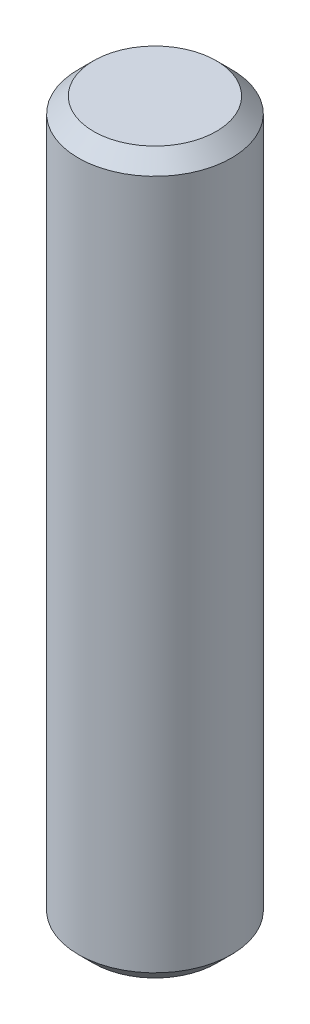
ISO-10303-21;
HEADER;
FILE_DESCRIPTION(('STEP AP214'),'2;1');
FILE_NAME('part.step','',(''),(''),'','','');
FILE_SCHEMA(('AUTOMOTIVE_DESIGN { 1 0 10303 214 1 1 1 1 }'));
ENDSEC;
DATA;
#1=APPLICATION_CONTEXT('core data for automotive mechanical design processes');
#2=APPLICATION_PROTOCOL_DEFINITION('international standard','automotive_design',2000,#1);
#3=PRODUCT_CONTEXT('',#1,'mechanical');
#4=PRODUCT('Part','Part','',(#3));
#5=PRODUCT_RELATED_PRODUCT_CATEGORY('part','',(#4));
#6=PRODUCT_DEFINITION_FORMATION('','',#4);
#7=PRODUCT_DEFINITION_CONTEXT('part definition',#1,'design');
#8=PRODUCT_DEFINITION('design','',#6,#7);
#9=PRODUCT_DEFINITION_SHAPE('','',#8);
#10=(LENGTH_UNIT() NAMED_UNIT(*) SI_UNIT(.MILLI.,.METRE.));
#11=(NAMED_UNIT(*) PLANE_ANGLE_UNIT() SI_UNIT($,.RADIAN.));
#12=(NAMED_UNIT(*) SI_UNIT($,.STERADIAN.) SOLID_ANGLE_UNIT());
#13=UNCERTAINTY_MEASURE_WITH_UNIT(LENGTH_MEASURE(1.E-05),#10,'distance_accuracy_value','');
#14=(GEOMETRIC_REPRESENTATION_CONTEXT(3) GLOBAL_UNCERTAINTY_ASSIGNED_CONTEXT((#13)) GLOBAL_UNIT_ASSIGNED_CONTEXT((#10,
#11,#12)) REPRESENTATION_CONTEXT('',''));
#15=CARTESIAN_POINT('',(0.,0.,0.));
#16=DIRECTION('',(0.,0.,1.));
#17=DIRECTION('',(1.,0.,0.));
#18=AXIS2_PLACEMENT_3D('',#15,#16,#17);
#19=CARTESIAN_POINT('',(0.,4.7,0.));
#20=DIRECTION('',(0.,-1.,0.));
#21=DIRECTION('',(0.,0.,-1.));
#22=AXIS2_PLACEMENT_3D('',#19,#20,#21);
#23=CYLINDRICAL_SURFACE('',#22,0.5);
#24=CARTESIAN_POINT('',(0.,0.1,0.));
#25=DIRECTION('',(0.,1.,0.));
#26=DIRECTION('',(0.,0.,1.));
#27=AXIS2_PLACEMENT_3D('',#24,#25,#26);
#28=CIRCLE('',#27,0.5);
#29=CARTESIAN_POINT('',(0.,0.1,0.5));
#30=VERTEX_POINT('',#29);
#31=EDGE_CURVE('E50',#30,#30,#28,.T.);
#32=ORIENTED_EDGE('',*,*,#31,.T.);
#33=EDGE_LOOP('',(#32));
#34=FACE_BOUND('',#33,.T.);
#35=CARTESIAN_POINT('',(0.,4.6,0.));
#36=DIRECTION('',(0.,1.,0.));
#37=DIRECTION('',(0.,0.,1.));
#38=AXIS2_PLACEMENT_3D('',#35,#36,#37);
#39=CIRCLE('',#38,0.5);
#40=CARTESIAN_POINT('',(0.,4.6,0.5));
#41=VERTEX_POINT('',#40);
#42=EDGE_CURVE('E54',#41,#41,#39,.F.);
#43=ORIENTED_EDGE('',*,*,#42,.T.);
#44=EDGE_LOOP('',(#43));
#45=FACE_BOUND('',#44,.T.);
#46=ADVANCED_FACE('F38',(#34,#45),#23,.T.);
#47=CARTESIAN_POINT('',(0.,4.7,0.));
#48=DIRECTION('',(0.,1.,0.));
#49=DIRECTION('',(0.,0.,1.));
#50=AXIS2_PLACEMENT_3D('',#47,#48,#49);
#51=PLANE('',#50);
#52=CARTESIAN_POINT('',(0.,4.7,0.));
#53=DIRECTION('',(0.,1.,0.));
#54=DIRECTION('',(0.,0.,1.));
#55=AXIS2_PLACEMENT_3D('',#52,#53,#54);
#56=CIRCLE('',#55,0.4);
#57=CARTESIAN_POINT('',(0.,4.7,0.4));
#58=VERTEX_POINT('',#57);
#59=EDGE_CURVE('E10',#58,#58,#56,.T.);
#60=ORIENTED_EDGE('',*,*,#59,.T.);
#61=EDGE_LOOP('',(#60));
#62=FACE_BOUND('',#61,.T.);
#63=ADVANCED_FACE('F70',(#62),#51,.T.);
#64=CARTESIAN_POINT('',(0.,0.,0.));
#65=DIRECTION('',(0.,1.,0.));
#66=DIRECTION('',(0.,0.,1.));
#67=AXIS2_PLACEMENT_3D('',#64,#65,#66);
#68=PLANE('',#67);
#69=CARTESIAN_POINT('',(0.,0.,0.));
#70=DIRECTION('',(0.,1.,0.));
#71=DIRECTION('',(0.,0.,1.));
#72=AXIS2_PLACEMENT_3D('',#69,#70,#71);
#73=CIRCLE('',#72,0.4);
#74=CARTESIAN_POINT('',(0.,0.,0.4));
#75=VERTEX_POINT('',#74);
#76=EDGE_CURVE('E46',#75,#75,#73,.F.);
#77=ORIENTED_EDGE('',*,*,#76,.T.);
#78=EDGE_LOOP('',(#77));
#79=FACE_BOUND('',#78,.T.);
#80=ADVANCED_FACE('F67',(#79),#68,.F.);
#81=CARTESIAN_POINT('',(0.,0.1,0.));
#82=DIRECTION('',(0.,1.,0.));
#83=DIRECTION('',(0.,0.,1.));
#84=AXIS2_PLACEMENT_3D('',#81,#82,#83);
#85=CONICAL_SURFACE('',#84,0.5,0.785398163397446);
#86=ORIENTED_EDGE('',*,*,#76,.F.);
#87=EDGE_LOOP('',(#86));
#88=FACE_BOUND('',#87,.T.);
#89=ORIENTED_EDGE('',*,*,#31,.F.);
#90=EDGE_LOOP('',(#89));
#91=FACE_BOUND('',#90,.T.);
#92=ADVANCED_FACE('F63',(#88,#91),#85,.T.);
#93=CARTESIAN_POINT('',(0.,4.7,0.));
#94=DIRECTION('',(0.,-1.,0.));
#95=DIRECTION('',(0.,0.,-1.));
#96=AXIS2_PLACEMENT_3D('',#93,#94,#95);
#97=CONICAL_SURFACE('',#96,0.4,0.785398163397446);
#98=ORIENTED_EDGE('',*,*,#42,.F.);
#99=EDGE_LOOP('',(#98));
#100=FACE_BOUND('',#99,.T.);
#101=ORIENTED_EDGE('',*,*,#59,.F.);
#102=EDGE_LOOP('',(#101));
#103=FACE_BOUND('',#102,.T.);
#104=ADVANCED_FACE('F41',(#100,#103),#97,.T.);
#105=CLOSED_SHELL('',(#46,#63,#80,#92,#104));
#106=MANIFOLD_SOLID_BREP('B2',#105);
#107=ADVANCED_BREP_SHAPE_REPRESENTATION('',(#18,#106),#14);
#108=SHAPE_DEFINITION_REPRESENTATION(#9,#107);
ENDSEC;
END-ISO-10303-21;
